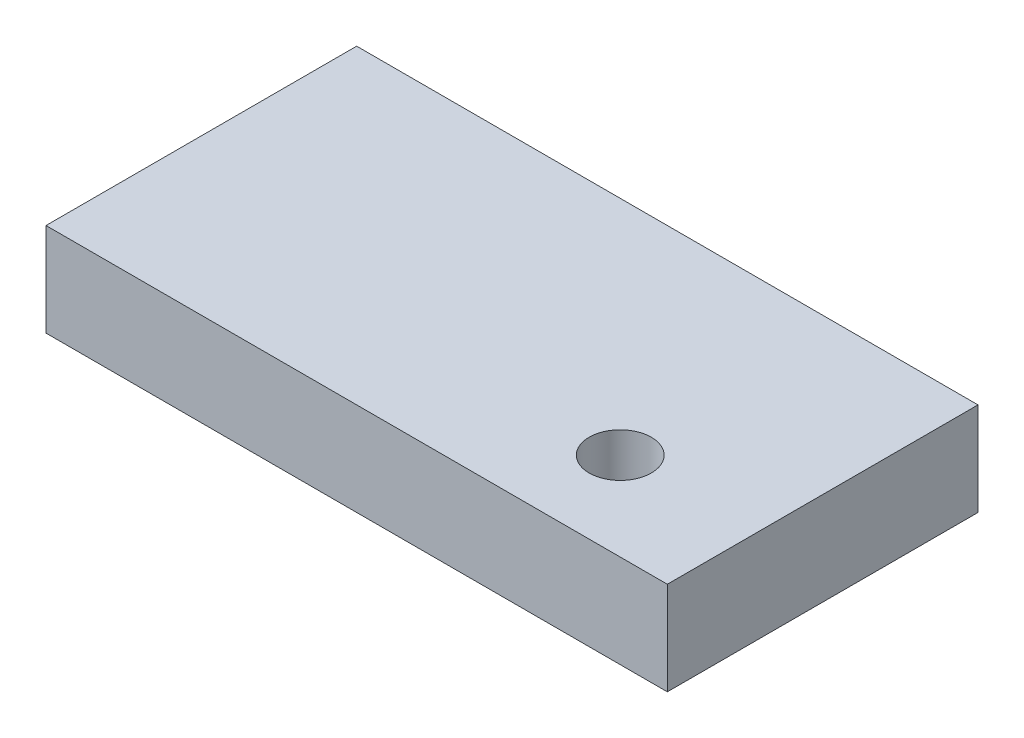
ISO-10303-21;
HEADER;
FILE_DESCRIPTION(('STEP AP214'),'2;1');
FILE_NAME('part.step','',(''),(''),'','','');
FILE_SCHEMA(('AUTOMOTIVE_DESIGN { 1 0 10303 214 1 1 1 1 }'));
ENDSEC;
DATA;
#1=APPLICATION_CONTEXT('core data for automotive mechanical design processes');
#2=APPLICATION_PROTOCOL_DEFINITION('international standard','automotive_design',2000,#1);
#3=PRODUCT_CONTEXT('',#1,'mechanical');
#4=PRODUCT('Part','Part','',(#3));
#5=PRODUCT_RELATED_PRODUCT_CATEGORY('part','',(#4));
#6=PRODUCT_DEFINITION_FORMATION('','',#4);
#7=PRODUCT_DEFINITION_CONTEXT('part definition',#1,'design');
#8=PRODUCT_DEFINITION('design','',#6,#7);
#9=PRODUCT_DEFINITION_SHAPE('','',#8);
#10=(LENGTH_UNIT() NAMED_UNIT(*) SI_UNIT(.MILLI.,.METRE.));
#11=(NAMED_UNIT(*) PLANE_ANGLE_UNIT() SI_UNIT($,.RADIAN.));
#12=(NAMED_UNIT(*) SI_UNIT($,.STERADIAN.) SOLID_ANGLE_UNIT());
#13=UNCERTAINTY_MEASURE_WITH_UNIT(LENGTH_MEASURE(1.E-05),#10,'distance_accuracy_value','');
#14=(GEOMETRIC_REPRESENTATION_CONTEXT(3) GLOBAL_UNCERTAINTY_ASSIGNED_CONTEXT((#13)) GLOBAL_UNIT_ASSIGNED_CONTEXT((#10,
#11,#12)) REPRESENTATION_CONTEXT('',''));
#15=CARTESIAN_POINT('',(0.,0.,0.));
#16=DIRECTION('',(0.,0.,1.));
#17=DIRECTION('',(1.,0.,0.));
#18=AXIS2_PLACEMENT_3D('',#15,#16,#17);
#19=CARTESIAN_POINT('',(50.,15.,25.));
#20=DIRECTION('',(-1.,0.,0.));
#21=DIRECTION('',(0.,0.,1.));
#22=AXIS2_PLACEMENT_3D('',#19,#20,#21);
#23=PLANE('',#22);
#24=DIRECTION('',(0.,0.,-1.));
#25=VECTOR('',#24,1.);
#26=CARTESIAN_POINT('',(50.,0.,25.));
#27=LINE('',#26,#25);
#28=CARTESIAN_POINT('',(50.,0.,25.));
#29=VERTEX_POINT('',#28);
#30=CARTESIAN_POINT('',(50.,0.,-25.));
#31=VERTEX_POINT('',#30);
#32=EDGE_CURVE('E96',#29,#31,#27,.T.);
#33=ORIENTED_EDGE('',*,*,#32,.T.);
#34=DIRECTION('',(0.,-1.,0.));
#35=VECTOR('',#34,1.);
#36=CARTESIAN_POINT('',(50.,15.,-25.));
#37=LINE('',#36,#35);
#38=CARTESIAN_POINT('',(50.,15.,-25.));
#39=VERTEX_POINT('',#38);
#40=EDGE_CURVE('E11',#39,#31,#37,.T.);
#41=ORIENTED_EDGE('',*,*,#40,.F.);
#42=DIRECTION('',(0.,0.,-1.));
#43=VECTOR('',#42,1.);
#44=CARTESIAN_POINT('',(50.,15.,25.));
#45=LINE('',#44,#43);
#46=CARTESIAN_POINT('',(50.,15.,25.));
#47=VERTEX_POINT('',#46);
#48=EDGE_CURVE('E84',#47,#39,#45,.T.);
#49=ORIENTED_EDGE('',*,*,#48,.F.);
#50=DIRECTION('',(0.,-1.,0.));
#51=VECTOR('',#50,1.);
#52=CARTESIAN_POINT('',(50.,15.,25.));
#53=LINE('',#52,#51);
#54=EDGE_CURVE('E92',#47,#29,#53,.T.);
#55=ORIENTED_EDGE('',*,*,#54,.T.);
#56=EDGE_LOOP('',(#33,#41,#49,#55));
#57=FACE_BOUND('',#56,.T.);
#58=ADVANCED_FACE('F33',(#57),#23,.F.);
#59=CARTESIAN_POINT('',(-50.,15.,-25.));
#60=DIRECTION('',(0.,0.,1.));
#61=DIRECTION('',(1.,0.,0.));
#62=AXIS2_PLACEMENT_3D('',#59,#60,#61);
#63=PLANE('',#62);
#64=DIRECTION('',(-1.,0.,0.));
#65=VECTOR('',#64,1.);
#66=CARTESIAN_POINT('',(-50.,0.,-25.));
#67=LINE('',#66,#65);
#68=CARTESIAN_POINT('',(-50.,0.,-25.));
#69=VERTEX_POINT('',#68);
#70=EDGE_CURVE('E88',#31,#69,#67,.T.);
#71=ORIENTED_EDGE('',*,*,#70,.T.);
#72=DIRECTION('',(0.,-1.,0.));
#73=VECTOR('',#72,1.);
#74=CARTESIAN_POINT('',(-50.,15.,-25.));
#75=LINE('',#74,#73);
#76=CARTESIAN_POINT('',(-50.,15.,-25.));
#77=VERTEX_POINT('',#76);
#78=EDGE_CURVE('E41',#77,#69,#75,.T.);
#79=ORIENTED_EDGE('',*,*,#78,.F.);
#80=DIRECTION('',(-1.,0.,0.));
#81=VECTOR('',#80,1.);
#82=CARTESIAN_POINT('',(-50.,15.,-25.));
#83=LINE('',#82,#81);
#84=EDGE_CURVE('E79',#39,#77,#83,.T.);
#85=ORIENTED_EDGE('',*,*,#84,.F.);
#86=ORIENTED_EDGE('',*,*,#40,.T.);
#87=EDGE_LOOP('',(#71,#79,#85,#86));
#88=FACE_BOUND('',#87,.T.);
#89=ADVANCED_FACE('F87',(#88),#63,.F.);
#90=CARTESIAN_POINT('',(-50.,15.,25.));
#91=DIRECTION('',(1.,0.,0.));
#92=DIRECTION('',(0.,0.,-1.));
#93=AXIS2_PLACEMENT_3D('',#90,#91,#92);
#94=PLANE('',#93);
#95=DIRECTION('',(0.,0.,1.));
#96=VECTOR('',#95,1.);
#97=CARTESIAN_POINT('',(-50.,0.,25.));
#98=LINE('',#97,#96);
#99=CARTESIAN_POINT('',(-50.,0.,25.));
#100=VERTEX_POINT('',#99);
#101=EDGE_CURVE('E66',#69,#100,#98,.T.);
#102=ORIENTED_EDGE('',*,*,#101,.T.);
#103=DIRECTION('',(0.,-1.,0.));
#104=VECTOR('',#103,1.);
#105=CARTESIAN_POINT('',(-50.,15.,25.));
#106=LINE('',#105,#104);
#107=CARTESIAN_POINT('',(-50.,15.,25.));
#108=VERTEX_POINT('',#107);
#109=EDGE_CURVE('E89',#108,#100,#106,.T.);
#110=ORIENTED_EDGE('',*,*,#109,.F.);
#111=DIRECTION('',(0.,0.,1.));
#112=VECTOR('',#111,1.);
#113=CARTESIAN_POINT('',(-50.,15.,25.));
#114=LINE('',#113,#112);
#115=EDGE_CURVE('E82',#77,#108,#114,.T.);
#116=ORIENTED_EDGE('',*,*,#115,.F.);
#117=ORIENTED_EDGE('',*,*,#78,.T.);
#118=EDGE_LOOP('',(#102,#110,#116,#117));
#119=FACE_BOUND('',#118,.T.);
#120=ADVANCED_FACE('F90',(#119),#94,.F.);
#121=CARTESIAN_POINT('',(-50.,15.,25.));
#122=DIRECTION('',(0.,0.,-1.));
#123=DIRECTION('',(-1.,0.,0.));
#124=AXIS2_PLACEMENT_3D('',#121,#122,#123);
#125=PLANE('',#124);
#126=DIRECTION('',(1.,0.,0.));
#127=VECTOR('',#126,1.);
#128=CARTESIAN_POINT('',(-50.,0.,25.));
#129=LINE('',#128,#127);
#130=EDGE_CURVE('E72',#100,#29,#129,.T.);
#131=ORIENTED_EDGE('',*,*,#130,.T.);
#132=ORIENTED_EDGE('',*,*,#54,.F.);
#133=DIRECTION('',(1.,0.,0.));
#134=VECTOR('',#133,1.);
#135=CARTESIAN_POINT('',(-50.,15.,25.));
#136=LINE('',#135,#134);
#137=EDGE_CURVE('E49',#108,#47,#136,.T.);
#138=ORIENTED_EDGE('',*,*,#137,.F.);
#139=ORIENTED_EDGE('',*,*,#109,.T.);
#140=EDGE_LOOP('',(#131,#132,#138,#139));
#141=FACE_BOUND('',#140,.T.);
#142=ADVANCED_FACE('F104',(#141),#125,.F.);
#143=CARTESIAN_POINT('',(0.,15.,0.));
#144=DIRECTION('',(0.,-1.,0.));
#145=DIRECTION('',(0.,0.,-1.));
#146=AXIS2_PLACEMENT_3D('',#143,#144,#145);
#147=PLANE('',#146);
#148=CARTESIAN_POINT('',(28.2098236514017,15.,10.7939320111967));
#149=DIRECTION('',(0.,1.,0.));
#150=DIRECTION('',(0.,0.,1.));
#151=AXIS2_PLACEMENT_3D('',#148,#149,#150);
#152=CIRCLE('',#151,5.);
#153=CARTESIAN_POINT('',(28.2098236514017,15.,15.7939320111967));
#154=VERTEX_POINT('',#153);
#155=EDGE_CURVE('E110',#154,#154,#152,.T.);
#156=ORIENTED_EDGE('',*,*,#155,.F.);
#157=EDGE_LOOP('',(#156));
#158=FACE_BOUND('',#157,.T.);
#159=ORIENTED_EDGE('',*,*,#48,.T.);
#160=ORIENTED_EDGE('',*,*,#84,.T.);
#161=ORIENTED_EDGE('',*,*,#115,.T.);
#162=ORIENTED_EDGE('',*,*,#137,.T.);
#163=EDGE_LOOP('',(#159,#160,#161,#162));
#164=FACE_BOUND('',#163,.T.);
#165=ADVANCED_FACE('F80',(#158,#164),#147,.F.);
#166=CARTESIAN_POINT('',(0.,0.,0.));
#167=DIRECTION('',(0.,-1.,0.));
#168=DIRECTION('',(0.,0.,-1.));
#169=AXIS2_PLACEMENT_3D('',#166,#167,#168);
#170=PLANE('',#169);
#171=CARTESIAN_POINT('',(28.2098236514017,0.,10.7939320111967));
#172=DIRECTION('',(0.,1.,0.));
#173=DIRECTION('',(0.,0.,1.));
#174=AXIS2_PLACEMENT_3D('',#171,#172,#173);
#175=CIRCLE('',#174,5.);
#176=CARTESIAN_POINT('',(28.2098236514017,0.,15.7939320111967));
#177=VERTEX_POINT('',#176);
#178=EDGE_CURVE('E99',#177,#177,#175,.T.);
#179=ORIENTED_EDGE('',*,*,#178,.T.);
#180=EDGE_LOOP('',(#179));
#181=FACE_BOUND('',#180,.T.);
#182=ORIENTED_EDGE('',*,*,#32,.F.);
#183=ORIENTED_EDGE('',*,*,#130,.F.);
#184=ORIENTED_EDGE('',*,*,#101,.F.);
#185=ORIENTED_EDGE('',*,*,#70,.F.);
#186=EDGE_LOOP('',(#182,#183,#184,#185));
#187=FACE_BOUND('',#186,.T.);
#188=ADVANCED_FACE('F107',(#181,#187),#170,.T.);
#189=CARTESIAN_POINT('',(28.2098236514017,0.,10.7939320111967));
#190=DIRECTION('',(0.,1.,0.));
#191=DIRECTION('',(0.,0.,1.));
#192=AXIS2_PLACEMENT_3D('',#189,#190,#191);
#193=CYLINDRICAL_SURFACE('',#192,5.);
#194=ORIENTED_EDGE('',*,*,#178,.F.);
#195=EDGE_LOOP('',(#194));
#196=FACE_BOUND('',#195,.T.);
#197=ORIENTED_EDGE('',*,*,#155,.T.);
#198=EDGE_LOOP('',(#197));
#199=FACE_BOUND('',#198,.T.);
#200=ADVANCED_FACE('F117',(#196,#199),#193,.F.);
#201=CLOSED_SHELL('',(#58,#89,#120,#142,#165,#188,#200));
#202=MANIFOLD_SOLID_BREP('B2',#201);
#203=ADVANCED_BREP_SHAPE_REPRESENTATION('',(#18,#202),#14);
#204=SHAPE_DEFINITION_REPRESENTATION(#9,#203);
ENDSEC;
END-ISO-10303-21;
